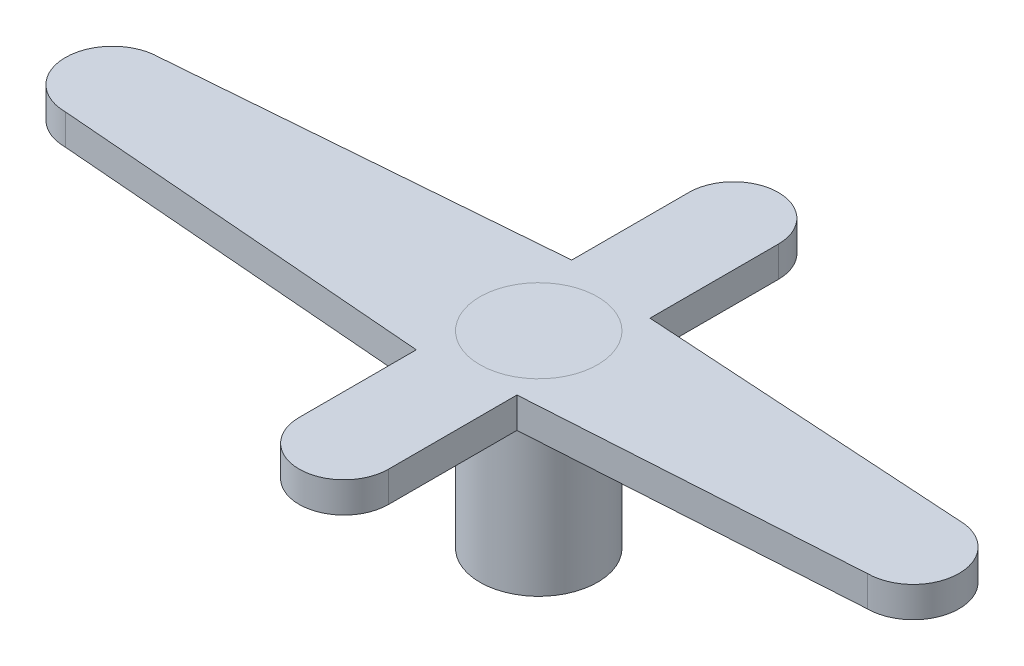
ISO-10303-21;
HEADER;
FILE_DESCRIPTION(('STEP AP214'),'2;1');
FILE_NAME('part.step','',(''),(''),'','','');
FILE_SCHEMA(('AUTOMOTIVE_DESIGN { 1 0 10303 214 1 1 1 1 }'));
ENDSEC;
DATA;
#1=APPLICATION_CONTEXT('core data for automotive mechanical design processes');
#2=APPLICATION_PROTOCOL_DEFINITION('international standard','automotive_design',2000,#1);
#3=PRODUCT_CONTEXT('',#1,'mechanical');
#4=PRODUCT('Part','Part','',(#3));
#5=PRODUCT_RELATED_PRODUCT_CATEGORY('part','',(#4));
#6=PRODUCT_DEFINITION_FORMATION('','',#4);
#7=PRODUCT_DEFINITION_CONTEXT('part definition',#1,'design');
#8=PRODUCT_DEFINITION('design','',#6,#7);
#9=PRODUCT_DEFINITION_SHAPE('','',#8);
#10=(LENGTH_UNIT() NAMED_UNIT(*) SI_UNIT(.MILLI.,.METRE.));
#11=(NAMED_UNIT(*) PLANE_ANGLE_UNIT() SI_UNIT($,.RADIAN.));
#12=(NAMED_UNIT(*) SI_UNIT($,.STERADIAN.) SOLID_ANGLE_UNIT());
#13=UNCERTAINTY_MEASURE_WITH_UNIT(LENGTH_MEASURE(1.E-05),#10,'distance_accuracy_value','');
#14=(GEOMETRIC_REPRESENTATION_CONTEXT(3) GLOBAL_UNCERTAINTY_ASSIGNED_CONTEXT((#13)) GLOBAL_UNIT_ASSIGNED_CONTEXT((#10,
#11,#12)) REPRESENTATION_CONTEXT('',''));
#15=CARTESIAN_POINT('',(0.,0.,0.));
#16=DIRECTION('',(0.,0.,1.));
#17=DIRECTION('',(1.,0.,0.));
#18=AXIS2_PLACEMENT_3D('',#15,#16,#17);
#19=CARTESIAN_POINT('',(-18.1,6.7,0.));
#20=DIRECTION('',(0.,1.,0.));
#21=DIRECTION('',(0.,0.,1.));
#22=AXIS2_PLACEMENT_3D('',#19,#20,#21);
#23=CYLINDRICAL_SURFACE('',#22,2.);
#24=CARTESIAN_POINT('',(-18.1,8.,0.));
#25=DIRECTION('',(0.,1.,0.));
#26=DIRECTION('',(0.,0.,1.));
#27=AXIS2_PLACEMENT_3D('',#24,#25,#26);
#28=CIRCLE('',#27,2.);
#29=CARTESIAN_POINT('',(-18.1,8.,-2.));
#30=VERTEX_POINT('',#29);
#31=CARTESIAN_POINT('',(-18.1,8.,2.));
#32=VERTEX_POINT('',#31);
#33=EDGE_CURVE('E176',#30,#32,#28,.T.);
#34=ORIENTED_EDGE('',*,*,#33,.F.);
#35=DIRECTION('',(0.,1.,0.));
#36=VECTOR('',#35,1.);
#37=CARTESIAN_POINT('',(-18.1,6.7,-2.));
#38=LINE('',#37,#36);
#39=CARTESIAN_POINT('',(-18.1,6.7,-2.));
#40=VERTEX_POINT('',#39);
#41=EDGE_CURVE('E12',#40,#30,#38,.T.);
#42=ORIENTED_EDGE('',*,*,#41,.F.);
#43=CARTESIAN_POINT('',(-18.1,6.7,0.));
#44=DIRECTION('',(0.,1.,0.));
#45=DIRECTION('',(0.,0.,1.));
#46=AXIS2_PLACEMENT_3D('',#43,#44,#45);
#47=CIRCLE('',#46,2.);
#48=CARTESIAN_POINT('',(-18.1,6.7,2.));
#49=VERTEX_POINT('',#48);
#50=EDGE_CURVE('E224',#40,#49,#47,.T.);
#51=ORIENTED_EDGE('',*,*,#50,.T.);
#52=DIRECTION('',(0.,1.,0.));
#53=VECTOR('',#52,1.);
#54=CARTESIAN_POINT('',(-18.1,6.7,2.));
#55=LINE('',#54,#53);
#56=EDGE_CURVE('E53',#49,#32,#55,.T.);
#57=ORIENTED_EDGE('',*,*,#56,.T.);
#58=EDGE_LOOP('',(#34,#42,#51,#57));
#59=FACE_BOUND('',#58,.T.);
#60=ADVANCED_FACE('F49',(#59),#23,.T.);
#61=CARTESIAN_POINT('',(-0.275277325559384,6.7,-3.4303789800477));
#62=DIRECTION('',(0.079989777107779,0.,0.996795683958477));
#63=DIRECTION('',(0.996795683958477,0.,-0.079989777107779));
#64=AXIS2_PLACEMENT_3D('',#61,#62,#63);
#65=PLANE('',#64);
#66=DIRECTION('',(0.996795683958477,0.,-0.079989777107779));
#67=VECTOR('',#66,1.);
#68=CARTESIAN_POINT('',(-0.275277325559384,8.,-3.4303789800477));
#69=LINE('',#68,#67);
#70=CARTESIAN_POINT('',(-1.9,8.,-3.3));
#71=VERTEX_POINT('',#70);
#72=EDGE_CURVE('E206',#30,#71,#69,.T.);
#73=ORIENTED_EDGE('',*,*,#72,.T.);
#74=DIRECTION('',(0.,1.,0.));
#75=VECTOR('',#74,1.);
#76=CARTESIAN_POINT('',(-1.9,6.7,-3.3));
#77=LINE('',#76,#75);
#78=CARTESIAN_POINT('',(-1.9,6.7,-3.3));
#79=VERTEX_POINT('',#78);
#80=EDGE_CURVE('E59',#79,#71,#77,.T.);
#81=ORIENTED_EDGE('',*,*,#80,.F.);
#82=DIRECTION('',(0.996795683958477,0.,-0.079989777107779));
#83=VECTOR('',#82,1.);
#84=CARTESIAN_POINT('',(-0.275277325559384,6.7,-3.4303789800477));
#85=LINE('',#84,#83);
#86=EDGE_CURVE('E155',#40,#79,#85,.T.);
#87=ORIENTED_EDGE('',*,*,#86,.F.);
#88=ORIENTED_EDGE('',*,*,#41,.T.);
#89=EDGE_LOOP('',(#73,#81,#87,#88));
#90=FACE_BOUND('',#89,.T.);
#91=ADVANCED_FACE('F228',(#90),#65,.F.);
#92=CARTESIAN_POINT('',(-1.9,6.7,0.));
#93=DIRECTION('',(1.,0.,0.));
#94=DIRECTION('',(0.,0.,-1.));
#95=AXIS2_PLACEMENT_3D('',#92,#93,#94);
#96=PLANE('',#95);
#97=DIRECTION('',(0.,0.,-1.));
#98=VECTOR('',#97,1.);
#99=CARTESIAN_POINT('',(-1.9,8.,0.));
#100=LINE('',#99,#98);
#101=CARTESIAN_POINT('',(-1.9,8.,-8.275));
#102=VERTEX_POINT('',#101);
#103=EDGE_CURVE('E108',#71,#102,#100,.T.);
#104=ORIENTED_EDGE('',*,*,#103,.T.);
#105=DIRECTION('',(0.,1.,0.));
#106=VECTOR('',#105,1.);
#107=CARTESIAN_POINT('',(-1.9,6.7,-8.275));
#108=LINE('',#107,#106);
#109=CARTESIAN_POINT('',(-1.9,6.7,-8.275));
#110=VERTEX_POINT('',#109);
#111=EDGE_CURVE('E159',#110,#102,#108,.T.);
#112=ORIENTED_EDGE('',*,*,#111,.F.);
#113=DIRECTION('',(0.,0.,-1.));
#114=VECTOR('',#113,1.);
#115=CARTESIAN_POINT('',(-1.9,6.7,0.));
#116=LINE('',#115,#114);
#117=EDGE_CURVE('E147',#79,#110,#116,.T.);
#118=ORIENTED_EDGE('',*,*,#117,.F.);
#119=ORIENTED_EDGE('',*,*,#80,.T.);
#120=EDGE_LOOP('',(#104,#112,#118,#119));
#121=FACE_BOUND('',#120,.T.);
#122=ADVANCED_FACE('F160',(#121),#96,.F.);
#123=CARTESIAN_POINT('',(0.,6.7,-8.275));
#124=DIRECTION('',(0.,1.,0.));
#125=DIRECTION('',(0.,0.,1.));
#126=AXIS2_PLACEMENT_3D('',#123,#124,#125);
#127=CYLINDRICAL_SURFACE('',#126,1.9);
#128=CARTESIAN_POINT('',(0.,8.,-8.275));
#129=DIRECTION('',(0.,1.,0.));
#130=DIRECTION('',(0.,0.,1.));
#131=AXIS2_PLACEMENT_3D('',#128,#129,#130);
#132=CIRCLE('',#131,1.9);
#133=CARTESIAN_POINT('',(1.9,8.,-8.275));
#134=VERTEX_POINT('',#133);
#135=EDGE_CURVE('E203',#134,#102,#132,.T.);
#136=ORIENTED_EDGE('',*,*,#135,.F.);
#137=DIRECTION('',(0.,1.,0.));
#138=VECTOR('',#137,1.);
#139=CARTESIAN_POINT('',(1.9,6.7,-8.275));
#140=LINE('',#139,#138);
#141=CARTESIAN_POINT('',(1.9,6.7,-8.275));
#142=VERTEX_POINT('',#141);
#143=EDGE_CURVE('E163',#142,#134,#140,.T.);
#144=ORIENTED_EDGE('',*,*,#143,.F.);
#145=CARTESIAN_POINT('',(0.,6.7,-8.275));
#146=DIRECTION('',(0.,1.,0.));
#147=DIRECTION('',(0.,0.,1.));
#148=AXIS2_PLACEMENT_3D('',#145,#146,#147);
#149=CIRCLE('',#148,1.9);
#150=EDGE_CURVE('E153',#142,#110,#149,.T.);
#151=ORIENTED_EDGE('',*,*,#150,.T.);
#152=ORIENTED_EDGE('',*,*,#111,.T.);
#153=EDGE_LOOP('',(#136,#144,#151,#152));
#154=FACE_BOUND('',#153,.T.);
#155=ADVANCED_FACE('F165',(#154),#127,.T.);
#156=CARTESIAN_POINT('',(1.9,6.7,0.));
#157=DIRECTION('',(1.,0.,0.));
#158=DIRECTION('',(0.,0.,-1.));
#159=AXIS2_PLACEMENT_3D('',#156,#157,#158);
#160=PLANE('',#159);
#161=DIRECTION('',(0.,0.,-1.));
#162=VECTOR('',#161,1.);
#163=CARTESIAN_POINT('',(1.9,8.,0.));
#164=LINE('',#163,#162);
#165=CARTESIAN_POINT('',(1.9,8.,-2.825));
#166=VERTEX_POINT('',#165);
#167=EDGE_CURVE('E200',#166,#134,#164,.T.);
#168=ORIENTED_EDGE('',*,*,#167,.F.);
#169=DIRECTION('',(0.,1.,0.));
#170=VECTOR('',#169,1.);
#171=CARTESIAN_POINT('',(1.9,6.7,-2.825));
#172=LINE('',#171,#170);
#173=CARTESIAN_POINT('',(1.9,6.7,-2.825));
#174=VERTEX_POINT('',#173);
#175=EDGE_CURVE('E211',#174,#166,#172,.T.);
#176=ORIENTED_EDGE('',*,*,#175,.F.);
#177=DIRECTION('',(0.,0.,-1.));
#178=VECTOR('',#177,1.);
#179=CARTESIAN_POINT('',(1.9,6.7,0.));
#180=LINE('',#179,#178);
#181=EDGE_CURVE('E166',#174,#142,#180,.T.);
#182=ORIENTED_EDGE('',*,*,#181,.T.);
#183=ORIENTED_EDGE('',*,*,#143,.T.);
#184=EDGE_LOOP('',(#168,#176,#182,#183));
#185=FACE_BOUND('',#184,.T.);
#186=ADVANCED_FACE('F311',(#185),#160,.T.);
#187=CARTESIAN_POINT('',(0.183268482490272,6.7,-2.93229571984436));
#188=DIRECTION('',(-0.0623782861551806,0.,0.998052578482889));
#189=DIRECTION('',(0.998052578482889,0.,0.0623782861551806));
#190=AXIS2_PLACEMENT_3D('',#187,#188,#189);
#191=PLANE('',#190);
#192=DIRECTION('',(0.998052578482889,0.,0.0623782861551806));
#193=VECTOR('',#192,1.);
#194=CARTESIAN_POINT('',(0.183268482490272,8.,-2.93229571984436));
#195=LINE('',#194,#193);
#196=CARTESIAN_POINT('',(15.9,8.,-1.95));
#197=VERTEX_POINT('',#196);
#198=EDGE_CURVE('E197',#166,#197,#195,.T.);
#199=ORIENTED_EDGE('',*,*,#198,.T.);
#200=DIRECTION('',(0.,1.,0.));
#201=VECTOR('',#200,1.);
#202=CARTESIAN_POINT('',(15.9,6.7,-1.95));
#203=LINE('',#202,#201);
#204=CARTESIAN_POINT('',(15.9,6.7,-1.95));
#205=VERTEX_POINT('',#204);
#206=EDGE_CURVE('E213',#205,#197,#203,.T.);
#207=ORIENTED_EDGE('',*,*,#206,.F.);
#208=DIRECTION('',(0.998052578482889,0.,0.0623782861551806));
#209=VECTOR('',#208,1.);
#210=CARTESIAN_POINT('',(0.183268482490272,6.7,-2.93229571984436));
#211=LINE('',#210,#209);
#212=EDGE_CURVE('E168',#174,#205,#211,.T.);
#213=ORIENTED_EDGE('',*,*,#212,.F.);
#214=ORIENTED_EDGE('',*,*,#175,.T.);
#215=EDGE_LOOP('',(#199,#207,#213,#214));
#216=FACE_BOUND('',#215,.T.);
#217=ADVANCED_FACE('F251',(#216),#191,.F.);
#218=CARTESIAN_POINT('',(15.9,6.7,0.));
#219=DIRECTION('',(0.,1.,0.));
#220=DIRECTION('',(0.,0.,1.));
#221=AXIS2_PLACEMENT_3D('',#218,#219,#220);
#222=CYLINDRICAL_SURFACE('',#221,1.95);
#223=CARTESIAN_POINT('',(15.9,8.,0.));
#224=DIRECTION('',(0.,1.,0.));
#225=DIRECTION('',(0.,0.,1.));
#226=AXIS2_PLACEMENT_3D('',#223,#224,#225);
#227=CIRCLE('',#226,1.95);
#228=CARTESIAN_POINT('',(15.9,8.,1.95));
#229=VERTEX_POINT('',#228);
#230=EDGE_CURVE('E194',#229,#197,#227,.T.);
#231=ORIENTED_EDGE('',*,*,#230,.F.);
#232=DIRECTION('',(0.,1.,0.));
#233=VECTOR('',#232,1.);
#234=CARTESIAN_POINT('',(15.9,6.7,1.95));
#235=LINE('',#234,#233);
#236=CARTESIAN_POINT('',(15.9,6.7,1.95));
#237=VERTEX_POINT('',#236);
#238=EDGE_CURVE('E215',#237,#229,#235,.T.);
#239=ORIENTED_EDGE('',*,*,#238,.F.);
#240=CARTESIAN_POINT('',(15.9,6.7,0.));
#241=DIRECTION('',(0.,1.,0.));
#242=DIRECTION('',(0.,0.,1.));
#243=AXIS2_PLACEMENT_3D('',#240,#241,#242);
#244=CIRCLE('',#243,1.95);
#245=EDGE_CURVE('E245',#237,#205,#244,.T.);
#246=ORIENTED_EDGE('',*,*,#245,.T.);
#247=ORIENTED_EDGE('',*,*,#206,.T.);
#248=EDGE_LOOP('',(#231,#239,#246,#247));
#249=FACE_BOUND('',#248,.T.);
#250=ADVANCED_FACE('F255',(#249),#222,.T.);
#251=CARTESIAN_POINT('',(0.183268482490272,6.7,2.93229571984436));
#252=DIRECTION('',(-0.0623782861551806,0.,-0.998052578482889));
#253=DIRECTION('',(-0.998052578482889,0.,0.0623782861551806));
#254=AXIS2_PLACEMENT_3D('',#251,#252,#253);
#255=PLANE('',#254);
#256=DIRECTION('',(-0.998052578482889,0.,0.0623782861551806));
#257=VECTOR('',#256,1.);
#258=CARTESIAN_POINT('',(0.183268482490272,8.,2.93229571984436));
#259=LINE('',#258,#257);
#260=CARTESIAN_POINT('',(1.9,8.,2.825));
#261=VERTEX_POINT('',#260);
#262=EDGE_CURVE('E191',#229,#261,#259,.T.);
#263=ORIENTED_EDGE('',*,*,#262,.T.);
#264=DIRECTION('',(0.,1.,0.));
#265=VECTOR('',#264,1.);
#266=CARTESIAN_POINT('',(1.9,6.7,2.825));
#267=LINE('',#266,#265);
#268=CARTESIAN_POINT('',(1.9,6.7,2.825));
#269=VERTEX_POINT('',#268);
#270=EDGE_CURVE('E217',#269,#261,#267,.T.);
#271=ORIENTED_EDGE('',*,*,#270,.F.);
#272=DIRECTION('',(-0.998052578482889,0.,0.0623782861551806));
#273=VECTOR('',#272,1.);
#274=CARTESIAN_POINT('',(0.183268482490272,6.7,2.93229571984436));
#275=LINE('',#274,#273);
#276=EDGE_CURVE('E243',#237,#269,#275,.T.);
#277=ORIENTED_EDGE('',*,*,#276,.F.);
#278=ORIENTED_EDGE('',*,*,#238,.T.);
#279=EDGE_LOOP('',(#263,#271,#277,#278));
#280=FACE_BOUND('',#279,.T.);
#281=ADVANCED_FACE('F260',(#280),#255,.F.);
#282=CARTESIAN_POINT('',(1.9,6.7,0.));
#283=DIRECTION('',(1.,0.,0.));
#284=DIRECTION('',(0.,0.,-1.));
#285=AXIS2_PLACEMENT_3D('',#282,#283,#284);
#286=PLANE('',#285);
#287=DIRECTION('',(0.,0.,-1.));
#288=VECTOR('',#287,1.);
#289=CARTESIAN_POINT('',(1.9,8.,0.));
#290=LINE('',#289,#288);
#291=CARTESIAN_POINT('',(1.9,8.,8.275));
#292=VERTEX_POINT('',#291);
#293=EDGE_CURVE('E188',#292,#261,#290,.T.);
#294=ORIENTED_EDGE('',*,*,#293,.F.);
#295=DIRECTION('',(0.,1.,0.));
#296=VECTOR('',#295,1.);
#297=CARTESIAN_POINT('',(1.9,6.7,8.275));
#298=LINE('',#297,#296);
#299=CARTESIAN_POINT('',(1.9,6.7,8.275));
#300=VERTEX_POINT('',#299);
#301=EDGE_CURVE('E219',#300,#292,#298,.T.);
#302=ORIENTED_EDGE('',*,*,#301,.F.);
#303=DIRECTION('',(0.,0.,-1.));
#304=VECTOR('',#303,1.);
#305=CARTESIAN_POINT('',(1.9,6.7,0.));
#306=LINE('',#305,#304);
#307=EDGE_CURVE('E240',#300,#269,#306,.T.);
#308=ORIENTED_EDGE('',*,*,#307,.T.);
#309=ORIENTED_EDGE('',*,*,#270,.T.);
#310=EDGE_LOOP('',(#294,#302,#308,#309));
#311=FACE_BOUND('',#310,.T.);
#312=ADVANCED_FACE('F271',(#311),#286,.T.);
#313=CARTESIAN_POINT('',(0.,6.7,8.275));
#314=DIRECTION('',(0.,1.,0.));
#315=DIRECTION('',(0.,0.,1.));
#316=AXIS2_PLACEMENT_3D('',#313,#314,#315);
#317=CYLINDRICAL_SURFACE('',#316,1.9);
#318=CARTESIAN_POINT('',(0.,8.,8.275));
#319=DIRECTION('',(0.,1.,0.));
#320=DIRECTION('',(0.,0.,1.));
#321=AXIS2_PLACEMENT_3D('',#318,#319,#320);
#322=CIRCLE('',#321,1.9);
#323=CARTESIAN_POINT('',(-1.9,8.,8.275));
#324=VERTEX_POINT('',#323);
#325=EDGE_CURVE('E185',#324,#292,#322,.T.);
#326=ORIENTED_EDGE('',*,*,#325,.F.);
#327=DIRECTION('',(0.,1.,0.));
#328=VECTOR('',#327,1.);
#329=CARTESIAN_POINT('',(-1.9,6.7,8.275));
#330=LINE('',#329,#328);
#331=CARTESIAN_POINT('',(-1.9,6.7,8.275));
#332=VERTEX_POINT('',#331);
#333=EDGE_CURVE('E221',#332,#324,#330,.T.);
#334=ORIENTED_EDGE('',*,*,#333,.F.);
#335=CARTESIAN_POINT('',(0.,6.7,8.275));
#336=DIRECTION('',(0.,1.,0.));
#337=DIRECTION('',(0.,0.,1.));
#338=AXIS2_PLACEMENT_3D('',#335,#336,#337);
#339=CIRCLE('',#338,1.9);
#340=EDGE_CURVE('E237',#332,#300,#339,.T.);
#341=ORIENTED_EDGE('',*,*,#340,.T.);
#342=ORIENTED_EDGE('',*,*,#301,.T.);
#343=EDGE_LOOP('',(#326,#334,#341,#342));
#344=FACE_BOUND('',#343,.T.);
#345=ADVANCED_FACE('F266',(#344),#317,.T.);
#346=CARTESIAN_POINT('',(-1.9,6.7,0.));
#347=DIRECTION('',(1.,0.,0.));
#348=DIRECTION('',(0.,0.,-1.));
#349=AXIS2_PLACEMENT_3D('',#346,#347,#348);
#350=PLANE('',#349);
#351=DIRECTION('',(0.,0.,-1.));
#352=VECTOR('',#351,1.);
#353=CARTESIAN_POINT('',(-1.9,8.,0.));
#354=LINE('',#353,#352);
#355=CARTESIAN_POINT('',(-1.9,8.,3.3));
#356=VERTEX_POINT('',#355);
#357=EDGE_CURVE('E182',#324,#356,#354,.T.);
#358=ORIENTED_EDGE('',*,*,#357,.T.);
#359=DIRECTION('',(0.,1.,0.));
#360=VECTOR('',#359,1.);
#361=CARTESIAN_POINT('',(-1.9,6.7,3.3));
#362=LINE('',#361,#360);
#363=CARTESIAN_POINT('',(-1.9,6.7,3.3));
#364=VERTEX_POINT('',#363);
#365=EDGE_CURVE('E222',#364,#356,#362,.T.);
#366=ORIENTED_EDGE('',*,*,#365,.F.);
#367=DIRECTION('',(0.,0.,-1.));
#368=VECTOR('',#367,1.);
#369=CARTESIAN_POINT('',(-1.9,6.7,0.));
#370=LINE('',#369,#368);
#371=EDGE_CURVE('E231',#332,#364,#370,.T.);
#372=ORIENTED_EDGE('',*,*,#371,.F.);
#373=ORIENTED_EDGE('',*,*,#333,.T.);
#374=EDGE_LOOP('',(#358,#366,#372,#373));
#375=FACE_BOUND('',#374,.T.);
#376=ADVANCED_FACE('F270',(#375),#350,.F.);
#377=CARTESIAN_POINT('',(0.,6.7,0.));
#378=DIRECTION('',(0.,1.,0.));
#379=DIRECTION('',(0.,0.,1.));
#380=AXIS2_PLACEMENT_3D('',#377,#378,#379);
#381=CYLINDRICAL_SURFACE('',#380,2.5);
#382=CARTESIAN_POINT('',(0.,6.7,0.));
#383=DIRECTION('',(0.,1.,0.));
#384=DIRECTION('',(0.,0.,1.));
#385=AXIS2_PLACEMENT_3D('',#382,#383,#384);
#386=CIRCLE('',#385,2.5);
#387=CARTESIAN_POINT('',(0.,6.7,2.5));
#388=VERTEX_POINT('',#387);
#389=EDGE_CURVE('E207',#388,#388,#386,.T.);
#390=ORIENTED_EDGE('',*,*,#389,.F.);
#391=EDGE_LOOP('',(#390));
#392=FACE_BOUND('',#391,.T.);
#393=CARTESIAN_POINT('',(0.,8.,0.));
#394=DIRECTION('',(0.,1.,0.));
#395=DIRECTION('',(0.,0.,1.));
#396=AXIS2_PLACEMENT_3D('',#393,#394,#395);
#397=CIRCLE('',#396,2.5);
#398=CARTESIAN_POINT('',(0.,8.,2.5));
#399=VERTEX_POINT('',#398);
#400=EDGE_CURVE('E173',#399,#399,#397,.T.);
#401=ORIENTED_EDGE('',*,*,#400,.T.);
#402=EDGE_LOOP('',(#401));
#403=FACE_BOUND('',#402,.T.);
#404=ADVANCED_FACE('F51',(#392,#403),#381,.F.);
#405=CARTESIAN_POINT('',(-0.275277325559384,6.7,3.4303789800477));
#406=DIRECTION('',(-0.079989777107779,0.,0.996795683958477));
#407=DIRECTION('',(0.996795683958477,0.,0.079989777107779));
#408=AXIS2_PLACEMENT_3D('',#405,#406,#407);
#409=PLANE('',#408);
#410=DIRECTION('',(0.996795683958477,0.,0.079989777107779));
#411=VECTOR('',#410,1.);
#412=CARTESIAN_POINT('',(-0.275277325559384,8.,3.4303789800477));
#413=LINE('',#412,#411);
#414=EDGE_CURVE('E179',#32,#356,#413,.T.);
#415=ORIENTED_EDGE('',*,*,#414,.F.);
#416=ORIENTED_EDGE('',*,*,#56,.F.);
#417=DIRECTION('',(0.996795683958477,0.,0.079989777107779));
#418=VECTOR('',#417,1.);
#419=CARTESIAN_POINT('',(-0.275277325559384,6.7,3.4303789800477));
#420=LINE('',#419,#418);
#421=EDGE_CURVE('E229',#49,#364,#420,.T.);
#422=ORIENTED_EDGE('',*,*,#421,.T.);
#423=ORIENTED_EDGE('',*,*,#365,.T.);
#424=EDGE_LOOP('',(#415,#416,#422,#423));
#425=FACE_BOUND('',#424,.T.);
#426=ADVANCED_FACE('F225',(#425),#409,.T.);
#427=CARTESIAN_POINT('',(0.,6.7,0.));
#428=DIRECTION('',(0.,1.,0.));
#429=DIRECTION('',(0.,0.,1.));
#430=AXIS2_PLACEMENT_3D('',#427,#428,#429);
#431=PLANE('',#430);
#432=ORIENTED_EDGE('',*,*,#389,.T.);
#433=EDGE_LOOP('',(#432));
#434=FACE_BOUND('',#433,.T.);
#435=ORIENTED_EDGE('',*,*,#50,.F.);
#436=ORIENTED_EDGE('',*,*,#86,.T.);
#437=ORIENTED_EDGE('',*,*,#117,.T.);
#438=ORIENTED_EDGE('',*,*,#150,.F.);
#439=ORIENTED_EDGE('',*,*,#181,.F.);
#440=ORIENTED_EDGE('',*,*,#212,.T.);
#441=ORIENTED_EDGE('',*,*,#245,.F.);
#442=ORIENTED_EDGE('',*,*,#276,.T.);
#443=ORIENTED_EDGE('',*,*,#307,.F.);
#444=ORIENTED_EDGE('',*,*,#340,.F.);
#445=ORIENTED_EDGE('',*,*,#371,.T.);
#446=ORIENTED_EDGE('',*,*,#421,.F.);
#447=EDGE_LOOP('',(#435,#436,#437,#438,#439,#440,#441,#442,#443,#444,#445,#446));
#448=FACE_BOUND('',#447,.T.);
#449=ADVANCED_FACE('F150',(#434,#448),#431,.F.);
#450=CARTESIAN_POINT('',(0.,8.,0.));
#451=DIRECTION('',(0.,1.,0.));
#452=DIRECTION('',(0.,0.,1.));
#453=AXIS2_PLACEMENT_3D('',#450,#451,#452);
#454=PLANE('',#453);
#455=ORIENTED_EDGE('',*,*,#400,.F.);
#456=EDGE_LOOP('',(#455));
#457=FACE_BOUND('',#456,.T.);
#458=ORIENTED_EDGE('',*,*,#33,.T.);
#459=ORIENTED_EDGE('',*,*,#414,.T.);
#460=ORIENTED_EDGE('',*,*,#357,.F.);
#461=ORIENTED_EDGE('',*,*,#325,.T.);
#462=ORIENTED_EDGE('',*,*,#293,.T.);
#463=ORIENTED_EDGE('',*,*,#262,.F.);
#464=ORIENTED_EDGE('',*,*,#230,.T.);
#465=ORIENTED_EDGE('',*,*,#198,.F.);
#466=ORIENTED_EDGE('',*,*,#167,.T.);
#467=ORIENTED_EDGE('',*,*,#135,.T.);
#468=ORIENTED_EDGE('',*,*,#103,.F.);
#469=ORIENTED_EDGE('',*,*,#72,.F.);
#470=EDGE_LOOP('',(#458,#459,#460,#461,#462,#463,#464,#465,#466,#467,#468,#469));
#471=FACE_BOUND('',#470,.T.);
#472=ADVANCED_FACE('F227',(#457,#471),#454,.T.);
#473=CLOSED_SHELL('',(#60,#91,#122,#155,#186,#217,#250,#281,#312,#345,#376,#404,#426,#449,#472));
#474=MANIFOLD_SOLID_BREP('B2',#473);
#475=CARTESIAN_POINT('',(0.,8.,0.));
#476=DIRECTION('',(0.,-1.,0.));
#477=DIRECTION('',(0.,0.,-1.));
#478=AXIS2_PLACEMENT_3D('',#475,#476,#477);
#479=CYLINDRICAL_SURFACE('',#478,2.5);
#480=CARTESIAN_POINT('',(0.,8.,0.));
#481=DIRECTION('',(0.,1.,0.));
#482=DIRECTION('',(0.,0.,1.));
#483=AXIS2_PLACEMENT_3D('',#480,#481,#482);
#484=CIRCLE('',#483,2.5);
#485=CARTESIAN_POINT('',(0.,8.,2.5));
#486=VERTEX_POINT('',#485);
#487=EDGE_CURVE('E48',#486,#486,#484,.T.);
#488=ORIENTED_EDGE('',*,*,#487,.F.);
#489=EDGE_LOOP('',(#488));
#490=FACE_BOUND('',#489,.T.);
#491=CARTESIAN_POINT('',(0.,0.,0.));
#492=DIRECTION('',(0.,1.,0.));
#493=DIRECTION('',(0.,0.,1.));
#494=AXIS2_PLACEMENT_3D('',#491,#492,#493);
#495=CIRCLE('',#494,2.5);
#496=CARTESIAN_POINT('',(0.,0.,2.5));
#497=VERTEX_POINT('',#496);
#498=EDGE_CURVE('E477',#497,#497,#495,.T.);
#499=ORIENTED_EDGE('',*,*,#498,.T.);
#500=EDGE_LOOP('',(#499));
#501=FACE_BOUND('',#500,.T.);
#502=ADVANCED_FACE('F474',(#490,#501),#479,.T.);
#503=CARTESIAN_POINT('',(0.,8.,0.));
#504=DIRECTION('',(0.,1.,0.));
#505=DIRECTION('',(0.,0.,1.));
#506=AXIS2_PLACEMENT_3D('',#503,#504,#505);
#507=PLANE('',#506);
#508=ORIENTED_EDGE('',*,*,#487,.T.);
#509=EDGE_LOOP('',(#508));
#510=FACE_BOUND('',#509,.T.);
#511=ADVANCED_FACE('F489',(#510),#507,.T.);
#512=CARTESIAN_POINT('',(0.,0.,0.));
#513=DIRECTION('',(0.,1.,0.));
#514=DIRECTION('',(0.,0.,1.));
#515=AXIS2_PLACEMENT_3D('',#512,#513,#514);
#516=PLANE('',#515);
#517=ORIENTED_EDGE('',*,*,#498,.F.);
#518=EDGE_LOOP('',(#517));
#519=FACE_BOUND('',#518,.T.);
#520=ADVANCED_FACE('F487',(#519),#516,.F.);
#521=CLOSED_SHELL('',(#502,#511,#520));
#522=MANIFOLD_SOLID_BREP('B6',#521);
#523=ADVANCED_BREP_SHAPE_REPRESENTATION('',(#18,#474,#522),#14);
#524=SHAPE_DEFINITION_REPRESENTATION(#9,#523);
ENDSEC;
END-ISO-10303-21;
